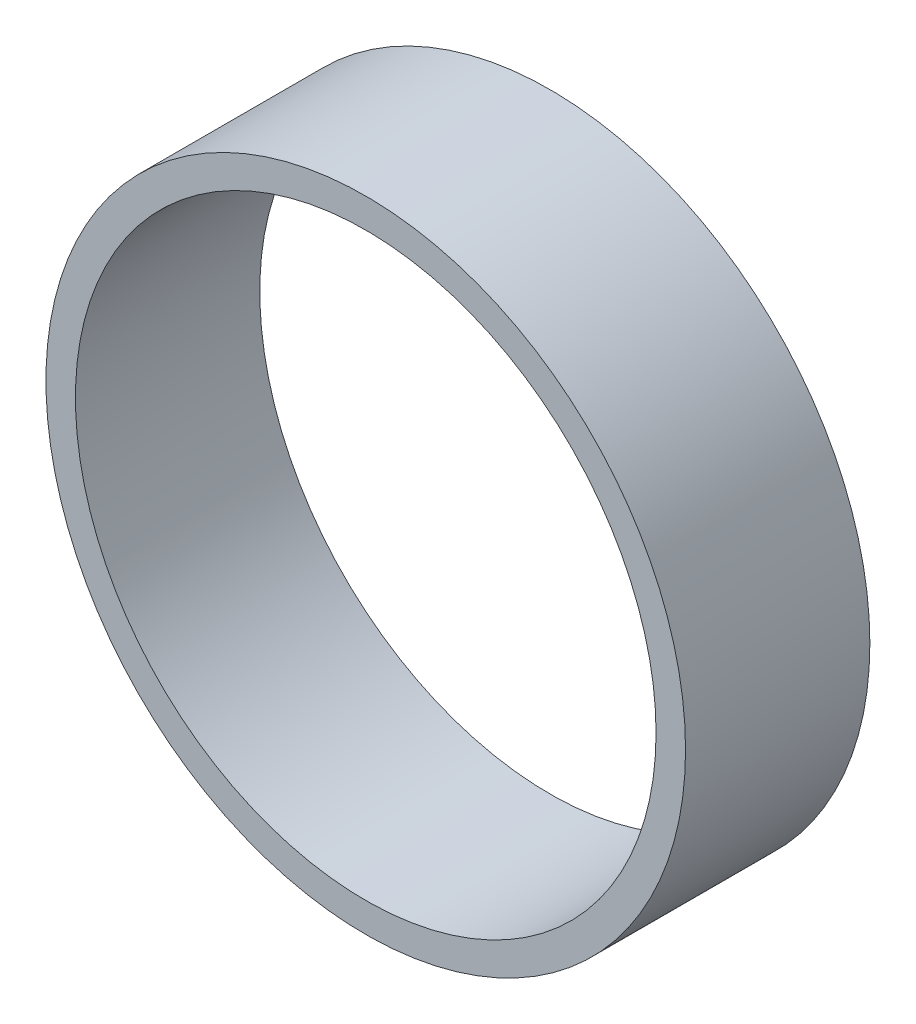
ISO-10303-21;
HEADER;
FILE_DESCRIPTION(('STEP AP214'),'2;1');
FILE_NAME('part.step','',(''),(''),'','','');
FILE_SCHEMA(('AUTOMOTIVE_DESIGN { 1 0 10303 214 1 1 1 1 }'));
ENDSEC;
DATA;
#1=APPLICATION_CONTEXT('core data for automotive mechanical design processes');
#2=APPLICATION_PROTOCOL_DEFINITION('international standard','automotive_design',2000,#1);
#3=PRODUCT_CONTEXT('',#1,'mechanical');
#4=PRODUCT('Part','Part','',(#3));
#5=PRODUCT_RELATED_PRODUCT_CATEGORY('part','',(#4));
#6=PRODUCT_DEFINITION_FORMATION('','',#4);
#7=PRODUCT_DEFINITION_CONTEXT('part definition',#1,'design');
#8=PRODUCT_DEFINITION('design','',#6,#7);
#9=PRODUCT_DEFINITION_SHAPE('','',#8);
#10=(LENGTH_UNIT() NAMED_UNIT(*) SI_UNIT(.MILLI.,.METRE.));
#11=(NAMED_UNIT(*) PLANE_ANGLE_UNIT() SI_UNIT($,.RADIAN.));
#12=(NAMED_UNIT(*) SI_UNIT($,.STERADIAN.) SOLID_ANGLE_UNIT());
#13=UNCERTAINTY_MEASURE_WITH_UNIT(LENGTH_MEASURE(1.E-05),#10,'distance_accuracy_value','');
#14=(GEOMETRIC_REPRESENTATION_CONTEXT(3) GLOBAL_UNCERTAINTY_ASSIGNED_CONTEXT((#13)) GLOBAL_UNIT_ASSIGNED_CONTEXT((#10,
#11,#12)) REPRESENTATION_CONTEXT('',''));
#15=CARTESIAN_POINT('',(0.,0.,0.));
#16=DIRECTION('',(0.,0.,1.));
#17=DIRECTION('',(1.,0.,0.));
#18=AXIS2_PLACEMENT_3D('',#15,#16,#17);
#19=CARTESIAN_POINT('',(0.,0.,20.));
#20=DIRECTION('',(0.,0.,1.));
#21=DIRECTION('',(1.,0.,0.));
#22=AXIS2_PLACEMENT_3D('',#19,#20,#21);
#23=PLANE('',#22);
#24=CARTESIAN_POINT('',(0.,0.,20.));
#25=DIRECTION('',(0.,0.,1.));
#26=DIRECTION('',(1.,0.,0.));
#27=AXIS2_PLACEMENT_3D('',#24,#25,#26);
#28=CIRCLE('',#27,34.7);
#29=CARTESIAN_POINT('',(34.7,0.,20.));
#30=VERTEX_POINT('',#29);
#31=EDGE_CURVE('E10',#30,#30,#28,.T.);
#32=ORIENTED_EDGE('',*,*,#31,.T.);
#33=EDGE_LOOP('',(#32));
#34=FACE_BOUND('',#33,.T.);
#35=CARTESIAN_POINT('',(0.,0.,20.));
#36=DIRECTION('',(0.,0.,1.));
#37=DIRECTION('',(1.,0.,0.));
#38=AXIS2_PLACEMENT_3D('',#35,#36,#37);
#39=CIRCLE('',#38,31.5);
#40=CARTESIAN_POINT('',(31.5,0.,20.));
#41=VERTEX_POINT('',#40);
#42=EDGE_CURVE('E55',#41,#41,#39,.T.);
#43=ORIENTED_EDGE('',*,*,#42,.F.);
#44=EDGE_LOOP('',(#43));
#45=FACE_BOUND('',#44,.T.);
#46=ADVANCED_FACE('F41',(#34,#45),#23,.T.);
#47=CARTESIAN_POINT('',(0.,0.,0.));
#48=DIRECTION('',(0.,0.,1.));
#49=DIRECTION('',(1.,0.,0.));
#50=AXIS2_PLACEMENT_3D('',#47,#48,#49);
#51=PLANE('',#50);
#52=CARTESIAN_POINT('',(0.,0.,0.));
#53=DIRECTION('',(0.,0.,1.));
#54=DIRECTION('',(1.,0.,0.));
#55=AXIS2_PLACEMENT_3D('',#52,#53,#54);
#56=CIRCLE('',#55,34.7);
#57=CARTESIAN_POINT('',(34.7,0.,0.));
#58=VERTEX_POINT('',#57);
#59=EDGE_CURVE('E44',#58,#58,#56,.T.);
#60=ORIENTED_EDGE('',*,*,#59,.F.);
#61=EDGE_LOOP('',(#60));
#62=FACE_BOUND('',#61,.T.);
#63=CARTESIAN_POINT('',(0.,0.,0.));
#64=DIRECTION('',(0.,0.,1.));
#65=DIRECTION('',(1.,0.,0.));
#66=AXIS2_PLACEMENT_3D('',#63,#64,#65);
#67=CIRCLE('',#66,31.5);
#68=CARTESIAN_POINT('',(31.5,0.,0.));
#69=VERTEX_POINT('',#68);
#70=EDGE_CURVE('E53',#69,#69,#67,.T.);
#71=ORIENTED_EDGE('',*,*,#70,.T.);
#72=EDGE_LOOP('',(#71));
#73=FACE_BOUND('',#72,.T.);
#74=ADVANCED_FACE('F63',(#62,#73),#51,.F.);
#75=CARTESIAN_POINT('',(0.,0.,20.));
#76=DIRECTION('',(0.,0.,-1.));
#77=DIRECTION('',(-1.,0.,0.));
#78=AXIS2_PLACEMENT_3D('',#75,#76,#77);
#79=CYLINDRICAL_SURFACE('',#78,34.7);
#80=ORIENTED_EDGE('',*,*,#31,.F.);
#81=EDGE_LOOP('',(#80));
#82=FACE_BOUND('',#81,.T.);
#83=ORIENTED_EDGE('',*,*,#59,.T.);
#84=EDGE_LOOP('',(#83));
#85=FACE_BOUND('',#84,.T.);
#86=ADVANCED_FACE('F43',(#82,#85),#79,.T.);
#87=CARTESIAN_POINT('',(0.,0.,20.));
#88=DIRECTION('',(0.,0.,-1.));
#89=DIRECTION('',(-1.,0.,0.));
#90=AXIS2_PLACEMENT_3D('',#87,#88,#89);
#91=CYLINDRICAL_SURFACE('',#90,31.5);
#92=ORIENTED_EDGE('',*,*,#42,.T.);
#93=EDGE_LOOP('',(#92));
#94=FACE_BOUND('',#93,.T.);
#95=ORIENTED_EDGE('',*,*,#70,.F.);
#96=EDGE_LOOP('',(#95));
#97=FACE_BOUND('',#96,.T.);
#98=ADVANCED_FACE('F58',(#94,#97),#91,.F.);
#99=CLOSED_SHELL('',(#46,#74,#86,#98));
#100=MANIFOLD_SOLID_BREP('B2',#99);
#101=ADVANCED_BREP_SHAPE_REPRESENTATION('',(#18,#100),#14);
#102=SHAPE_DEFINITION_REPRESENTATION(#9,#101);
ENDSEC;
END-ISO-10303-21;
